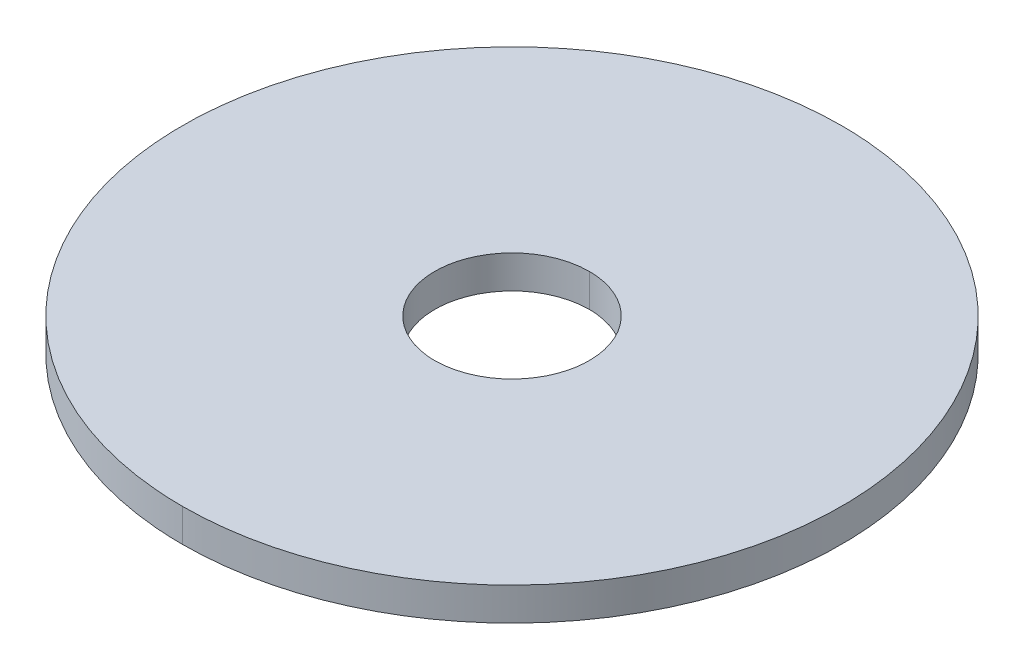
ISO-10303-21;
HEADER;
FILE_DESCRIPTION(('STEP AP214'),'2;1');
FILE_NAME('part.step','',(''),(''),'','','');
FILE_SCHEMA(('AUTOMOTIVE_DESIGN { 1 0 10303 214 1 1 1 1 }'));
ENDSEC;
DATA;
#1=APPLICATION_CONTEXT('core data for automotive mechanical design processes');
#2=APPLICATION_PROTOCOL_DEFINITION('international standard','automotive_design',2000,#1);
#3=PRODUCT_CONTEXT('',#1,'mechanical');
#4=PRODUCT('Part','Part','',(#3));
#5=PRODUCT_RELATED_PRODUCT_CATEGORY('part','',(#4));
#6=PRODUCT_DEFINITION_FORMATION('','',#4);
#7=PRODUCT_DEFINITION_CONTEXT('part definition',#1,'design');
#8=PRODUCT_DEFINITION('design','',#6,#7);
#9=PRODUCT_DEFINITION_SHAPE('','',#8);
#10=(LENGTH_UNIT() NAMED_UNIT(*) SI_UNIT(.MILLI.,.METRE.));
#11=(NAMED_UNIT(*) PLANE_ANGLE_UNIT() SI_UNIT($,.RADIAN.));
#12=(NAMED_UNIT(*) SI_UNIT($,.STERADIAN.) SOLID_ANGLE_UNIT());
#13=UNCERTAINTY_MEASURE_WITH_UNIT(LENGTH_MEASURE(1.E-05),#10,'distance_accuracy_value','');
#14=(GEOMETRIC_REPRESENTATION_CONTEXT(3) GLOBAL_UNCERTAINTY_ASSIGNED_CONTEXT((#13)) GLOBAL_UNIT_ASSIGNED_CONTEXT((#10,
#11,#12)) REPRESENTATION_CONTEXT('',''));
#15=CARTESIAN_POINT('',(0.,0.,0.));
#16=DIRECTION('',(0.,0.,1.));
#17=DIRECTION('',(1.,0.,0.));
#18=AXIS2_PLACEMENT_3D('',#15,#16,#17);
#19=CARTESIAN_POINT('',(0.,1.6,3.75));
#20=CARTESIAN_POINT('',(-3.75,1.6,3.75));
#21=CARTESIAN_POINT('',(-3.75,1.6,0.));
#22=CARTESIAN_POINT('',(-3.75,1.6,-3.75));
#23=CARTESIAN_POINT('',(0.,1.6,-3.75));
#24=CARTESIAN_POINT('',(0.,0.,3.75));
#25=CARTESIAN_POINT('',(-3.75,0.,3.75));
#26=CARTESIAN_POINT('',(-3.75,0.,0.));
#27=CARTESIAN_POINT('',(-3.75,0.,-3.75));
#28=CARTESIAN_POINT('',(0.,0.,-3.75));
#29=(BOUNDED_SURFACE() B_SPLINE_SURFACE(1,2,((#19,#20,#21,#22,#23),(#24,#25,#26,#27,#28)),
.UNSPECIFIED.,.F.,.F.,.F.) B_SPLINE_SURFACE_WITH_KNOTS((2,2),(3,2,3),(-0.213333333333333,
0.213333333333333),(-3.14159265358979,-1.5707963267949,0.),
.UNSPECIFIED.) GEOMETRIC_REPRESENTATION_ITEM() RATIONAL_B_SPLINE_SURFACE(((1.,0.707106781186548,
1.,0.707106781186548,1.),(1.,0.707106781186548,1.,0.707106781186548,1.))) REPRESENTATION_ITEM('') SURFACE());
#30=CARTESIAN_POINT('',(0.,1.6,-3.75));
#31=CARTESIAN_POINT('',(0.,0.,-3.75));
#32=(BOUNDED_CURVE() B_SPLINE_CURVE(1,(#30,#31),.UNSPECIFIED.,.F.,
.F.) B_SPLINE_CURVE_WITH_KNOTS((2,2),(-0.213333333333333,0.213333333333333),
.UNSPECIFIED.) CURVE() GEOMETRIC_REPRESENTATION_ITEM() RATIONAL_B_SPLINE_CURVE((1.,1.)) REPRESENTATION_ITEM(''));
#33=CARTESIAN_POINT('',(0.,1.6,-3.75));
#34=VERTEX_POINT('',#33);
#35=CARTESIAN_POINT('',(0.,0.,-3.75));
#36=VERTEX_POINT('',#35);
#37=EDGE_CURVE('E93',#34,#36,#32,.T.);
#38=CARTESIAN_POINT('',(0.,1.6,-3.75));
#39=CARTESIAN_POINT('',(-3.75,1.6,-3.75));
#40=CARTESIAN_POINT('',(-3.75,1.6,0.));
#41=CARTESIAN_POINT('',(-3.75,1.6,3.75));
#42=CARTESIAN_POINT('',(0.,1.6,3.75));
#43=(BOUNDED_CURVE() B_SPLINE_CURVE(2,(#38,#39,#40,#41,#42),.UNSPECIFIED.,.F.,
.F.) B_SPLINE_CURVE_WITH_KNOTS((3,2,3),(0.,1.5707963267949,3.14159265358979),
.UNSPECIFIED.) CURVE() GEOMETRIC_REPRESENTATION_ITEM() RATIONAL_B_SPLINE_CURVE((1.,
0.707106781186548,1.,0.707106781186548,1.)) REPRESENTATION_ITEM(''));
#44=CARTESIAN_POINT('',(0.,1.6,3.75));
#45=VERTEX_POINT('',#44);
#46=EDGE_CURVE('E11',#34,#45,#43,.T.);
#47=CARTESIAN_POINT('',(0.,1.6,3.75));
#48=CARTESIAN_POINT('',(0.,0.,3.75));
#49=(BOUNDED_CURVE() B_SPLINE_CURVE(1,(#47,#48),.UNSPECIFIED.,.F.,
.F.) B_SPLINE_CURVE_WITH_KNOTS((2,2),(-0.213333333333333,0.213333333333333),
.UNSPECIFIED.) CURVE() GEOMETRIC_REPRESENTATION_ITEM() RATIONAL_B_SPLINE_CURVE((1.,1.)) REPRESENTATION_ITEM(''));
#50=CARTESIAN_POINT('',(0.,0.,3.75));
#51=VERTEX_POINT('',#50);
#52=EDGE_CURVE('E99',#45,#51,#49,.T.);
#53=CARTESIAN_POINT('',(0.,0.,-3.75));
#54=CARTESIAN_POINT('',(-3.75,0.,-3.75));
#55=CARTESIAN_POINT('',(-3.75,0.,0.));
#56=CARTESIAN_POINT('',(-3.75,0.,3.75));
#57=CARTESIAN_POINT('',(0.,0.,3.75));
#58=(BOUNDED_CURVE() B_SPLINE_CURVE(2,(#53,#54,#55,#56,#57),.UNSPECIFIED.,.F.,
.F.) B_SPLINE_CURVE_WITH_KNOTS((3,2,3),(0.,1.5707963267949,3.14159265358979),
.UNSPECIFIED.) CURVE() GEOMETRIC_REPRESENTATION_ITEM() RATIONAL_B_SPLINE_CURVE((1.,
0.707106781186548,1.,0.707106781186548,1.)) REPRESENTATION_ITEM(''));
#59=EDGE_CURVE('E23',#36,#51,#58,.T.);
#60=ORIENTED_EDGE('',*,*,#37,.F.);
#61=ORIENTED_EDGE('',*,*,#46,.T.);
#62=ORIENTED_EDGE('',*,*,#52,.T.);
#63=ORIENTED_EDGE('',*,*,#59,.F.);
#64=EDGE_LOOP('',(#60,#61,#62,#63));
#65=FACE_BOUND('',#64,.T.);
#66=ADVANCED_FACE('F17',(#65),#29,.T.);
#67=CARTESIAN_POINT('',(0.,0.,16.));
#68=CARTESIAN_POINT('',(-16.,0.,16.));
#69=CARTESIAN_POINT('',(-16.,0.,0.));
#70=CARTESIAN_POINT('',(-16.,0.,-16.));
#71=CARTESIAN_POINT('',(0.,0.,-16.));
#72=CARTESIAN_POINT('',(0.,1.6,16.));
#73=CARTESIAN_POINT('',(-16.,1.6,16.));
#74=CARTESIAN_POINT('',(-16.,1.6,0.));
#75=CARTESIAN_POINT('',(-16.,1.6,-16.));
#76=CARTESIAN_POINT('',(0.,1.6,-16.));
#77=(BOUNDED_SURFACE() B_SPLINE_SURFACE(1,2,((#67,#68,#69,#70,#71),(#72,#73,#74,#75,#76)),
.UNSPECIFIED.,.F.,.F.,.F.) B_SPLINE_SURFACE_WITH_KNOTS((2,2),(3,2,3),(-0.05,0.05),
(-3.14159265358979,-1.5707963267949,0.),
.UNSPECIFIED.) GEOMETRIC_REPRESENTATION_ITEM() RATIONAL_B_SPLINE_SURFACE(((1.,0.707106781186548,
1.,0.707106781186548,1.),(1.,0.707106781186548,1.,0.707106781186548,1.))) REPRESENTATION_ITEM('') SURFACE());
#78=CARTESIAN_POINT('',(0.,0.,-16.));
#79=CARTESIAN_POINT('',(0.,1.6,-16.));
#80=(BOUNDED_CURVE() B_SPLINE_CURVE(1,(#78,#79),.UNSPECIFIED.,.F.,
.F.) B_SPLINE_CURVE_WITH_KNOTS((2,2),(-0.05,0.05),
.UNSPECIFIED.) CURVE() GEOMETRIC_REPRESENTATION_ITEM() RATIONAL_B_SPLINE_CURVE((1.,1.)) REPRESENTATION_ITEM(''));
#81=CARTESIAN_POINT('',(0.,0.,-16.));
#82=VERTEX_POINT('',#81);
#83=CARTESIAN_POINT('',(0.,1.6,-16.));
#84=VERTEX_POINT('',#83);
#85=EDGE_CURVE('E118',#82,#84,#80,.T.);
#86=CARTESIAN_POINT('',(0.,0.,-16.));
#87=CARTESIAN_POINT('',(-16.,0.,-16.));
#88=CARTESIAN_POINT('',(-16.,0.,0.));
#89=CARTESIAN_POINT('',(-16.,0.,16.));
#90=CARTESIAN_POINT('',(0.,0.,16.));
#91=(BOUNDED_CURVE() B_SPLINE_CURVE(2,(#86,#87,#88,#89,#90),.UNSPECIFIED.,.F.,
.F.) B_SPLINE_CURVE_WITH_KNOTS((3,2,3),(-3.14159265358981,-1.57079632679491,0.),
.UNSPECIFIED.) CURVE() GEOMETRIC_REPRESENTATION_ITEM() RATIONAL_B_SPLINE_CURVE((1.,
0.707106781186548,1.,0.707106781186547,1.)) REPRESENTATION_ITEM(''));
#92=CARTESIAN_POINT('',(0.,0.,16.));
#93=VERTEX_POINT('',#92);
#94=EDGE_CURVE('E57',#82,#93,#91,.T.);
#95=CARTESIAN_POINT('',(0.,0.,16.));
#96=CARTESIAN_POINT('',(0.,1.6,16.));
#97=(BOUNDED_CURVE() B_SPLINE_CURVE(1,(#95,#96),.UNSPECIFIED.,.F.,
.F.) B_SPLINE_CURVE_WITH_KNOTS((2,2),(-0.05,0.05),
.UNSPECIFIED.) CURVE() GEOMETRIC_REPRESENTATION_ITEM() RATIONAL_B_SPLINE_CURVE((1.,1.)) REPRESENTATION_ITEM(''));
#98=CARTESIAN_POINT('',(0.,1.6,16.));
#99=VERTEX_POINT('',#98);
#100=EDGE_CURVE('E133',#93,#99,#97,.T.);
#101=CARTESIAN_POINT('',(0.,1.6,-16.));
#102=CARTESIAN_POINT('',(-16.,1.6,-16.));
#103=CARTESIAN_POINT('',(-16.,1.6,0.));
#104=CARTESIAN_POINT('',(-16.,1.6,16.));
#105=CARTESIAN_POINT('',(0.,1.6,16.));
#106=(BOUNDED_CURVE() B_SPLINE_CURVE(2,(#101,#102,#103,#104,#105),.UNSPECIFIED.,.F.,
.F.) B_SPLINE_CURVE_WITH_KNOTS((3,2,3),(-3.14159265358981,-1.57079632679491,0.),
.UNSPECIFIED.) CURVE() GEOMETRIC_REPRESENTATION_ITEM() RATIONAL_B_SPLINE_CURVE((1.,
0.707106781186548,1.,0.707106781186547,1.)) REPRESENTATION_ITEM(''));
#107=EDGE_CURVE('E32',#84,#99,#106,.T.);
#108=ORIENTED_EDGE('',*,*,#85,.F.);
#109=ORIENTED_EDGE('',*,*,#94,.T.);
#110=ORIENTED_EDGE('',*,*,#100,.T.);
#111=ORIENTED_EDGE('',*,*,#107,.F.);
#112=EDGE_LOOP('',(#108,#109,#110,#111));
#113=FACE_BOUND('',#112,.T.);
#114=ADVANCED_FACE('F164',(#113),#77,.T.);
#115=CARTESIAN_POINT('',(-16.01,1.6,-16.01));
#116=CARTESIAN_POINT('',(16.01,1.6,-16.01));
#117=CARTESIAN_POINT('',(-16.01,1.6,16.01));
#118=CARTESIAN_POINT('',(16.01,1.6,16.01));
#119=(BOUNDED_SURFACE() B_SPLINE_SURFACE(1,1,((#115,#116),(#117,#118)),.UNSPECIFIED.,.F.,.F.,
.F.) B_SPLINE_SURFACE_WITH_KNOTS((2,2),(2,2),(-1.601,1.601),(-1.601,1.601),
.UNSPECIFIED.) GEOMETRIC_REPRESENTATION_ITEM() RATIONAL_B_SPLINE_SURFACE(((1.,1.),(1.,1.))) REPRESENTATION_ITEM('') SURFACE());
#120=CARTESIAN_POINT('',(0.,1.6,3.75));
#121=CARTESIAN_POINT('',(3.75,1.6,3.75));
#122=CARTESIAN_POINT('',(3.75,1.6,0.));
#123=CARTESIAN_POINT('',(3.75,1.6,-3.75));
#124=CARTESIAN_POINT('',(0.,1.6,-3.75));
#125=(BOUNDED_CURVE() B_SPLINE_CURVE(2,(#120,#121,#122,#123,#124),.UNSPECIFIED.,.F.,
.F.) B_SPLINE_CURVE_WITH_KNOTS((3,2,3),(3.14159265358979,4.71238898038469,6.28318530717959),
.UNSPECIFIED.) CURVE() GEOMETRIC_REPRESENTATION_ITEM() RATIONAL_B_SPLINE_CURVE((1.,
0.707106781186548,1.,0.707106781186547,1.)) REPRESENTATION_ITEM(''));
#126=EDGE_CURVE('E89',#45,#34,#125,.T.);
#127=CARTESIAN_POINT('',(0.,1.6,16.));
#128=CARTESIAN_POINT('',(16.,1.6,16.));
#129=CARTESIAN_POINT('',(16.,1.6,0.));
#130=CARTESIAN_POINT('',(16.,1.6,-16.));
#131=CARTESIAN_POINT('',(0.,1.6,-16.));
#132=(BOUNDED_CURVE() B_SPLINE_CURVE(2,(#127,#128,#129,#130,#131),.UNSPECIFIED.,.F.,
.F.) B_SPLINE_CURVE_WITH_KNOTS((3,2,3),(0.,1.57079632679488,3.14159265358978),
.UNSPECIFIED.) CURVE() GEOMETRIC_REPRESENTATION_ITEM() RATIONAL_B_SPLINE_CURVE((1.,
0.707106781186548,1.,0.707106781186547,1.)) REPRESENTATION_ITEM(''));
#133=EDGE_CURVE('E126',#99,#84,#132,.T.);
#134=ORIENTED_EDGE('',*,*,#46,.F.);
#135=ORIENTED_EDGE('',*,*,#126,.F.);
#136=EDGE_LOOP('',(#134,#135));
#137=FACE_BOUND('',#136,.T.);
#138=ORIENTED_EDGE('',*,*,#107,.T.);
#139=ORIENTED_EDGE('',*,*,#133,.T.);
#140=EDGE_LOOP('',(#138,#139));
#141=FACE_BOUND('',#140,.T.);
#142=ADVANCED_FACE('F87',(#137,#141),#119,.T.);
#143=CARTESIAN_POINT('',(-16.01,0.,16.01));
#144=CARTESIAN_POINT('',(16.01,0.,16.01));
#145=CARTESIAN_POINT('',(-16.01,0.,-16.01));
#146=CARTESIAN_POINT('',(16.01,0.,-16.01));
#147=(BOUNDED_SURFACE() B_SPLINE_SURFACE(1,1,((#143,#144),(#145,#146)),.UNSPECIFIED.,.F.,.F.,
.F.) B_SPLINE_SURFACE_WITH_KNOTS((2,2),(2,2),(-1.601,1.601),(-1.601,1.601),
.UNSPECIFIED.) GEOMETRIC_REPRESENTATION_ITEM() RATIONAL_B_SPLINE_SURFACE(((1.,1.),(1.,1.))) REPRESENTATION_ITEM('') SURFACE());
#148=CARTESIAN_POINT('',(0.,0.,3.75));
#149=CARTESIAN_POINT('',(3.75,0.,3.75));
#150=CARTESIAN_POINT('',(3.75,0.,0.));
#151=CARTESIAN_POINT('',(3.75,0.,-3.75));
#152=CARTESIAN_POINT('',(0.,0.,-3.75));
#153=(BOUNDED_CURVE() B_SPLINE_CURVE(2,(#148,#149,#150,#151,#152),.UNSPECIFIED.,.F.,
.F.) B_SPLINE_CURVE_WITH_KNOTS((3,2,3),(3.14159265358979,4.71238898038469,6.28318530717959),
.UNSPECIFIED.) CURVE() GEOMETRIC_REPRESENTATION_ITEM() RATIONAL_B_SPLINE_CURVE((1.,
0.707106781186548,1.,0.707106781186547,1.)) REPRESENTATION_ITEM(''));
#154=EDGE_CURVE('E97',#51,#36,#153,.T.);
#155=CARTESIAN_POINT('',(0.,0.,16.));
#156=CARTESIAN_POINT('',(16.,0.,16.));
#157=CARTESIAN_POINT('',(16.,0.,0.));
#158=CARTESIAN_POINT('',(16.,0.,-16.));
#159=CARTESIAN_POINT('',(0.,0.,-16.));
#160=(BOUNDED_CURVE() B_SPLINE_CURVE(2,(#155,#156,#157,#158,#159),.UNSPECIFIED.,.F.,
.F.) B_SPLINE_CURVE_WITH_KNOTS((3,2,3),(0.,1.57079632679488,3.14159265358978),
.UNSPECIFIED.) CURVE() GEOMETRIC_REPRESENTATION_ITEM() RATIONAL_B_SPLINE_CURVE((1.,
0.707106781186548,1.,0.707106781186547,1.)) REPRESENTATION_ITEM(''));
#161=EDGE_CURVE('E117',#93,#82,#160,.T.);
#162=ORIENTED_EDGE('',*,*,#59,.T.);
#163=ORIENTED_EDGE('',*,*,#154,.T.);
#164=EDGE_LOOP('',(#162,#163));
#165=FACE_BOUND('',#164,.T.);
#166=ORIENTED_EDGE('',*,*,#94,.F.);
#167=ORIENTED_EDGE('',*,*,#161,.F.);
#168=EDGE_LOOP('',(#166,#167));
#169=FACE_BOUND('',#168,.T.);
#170=ADVANCED_FACE('F156',(#165,#169),#147,.T.);
#171=CARTESIAN_POINT('',(0.,0.,-16.));
#172=CARTESIAN_POINT('',(16.,0.,-16.));
#173=CARTESIAN_POINT('',(16.,0.,0.));
#174=CARTESIAN_POINT('',(16.,0.,16.));
#175=CARTESIAN_POINT('',(0.,0.,16.));
#176=CARTESIAN_POINT('',(0.,1.6,-16.));
#177=CARTESIAN_POINT('',(16.,1.6,-16.));
#178=CARTESIAN_POINT('',(16.,1.6,0.));
#179=CARTESIAN_POINT('',(16.,1.6,16.));
#180=CARTESIAN_POINT('',(0.,1.6,16.));
#181=(BOUNDED_SURFACE() B_SPLINE_SURFACE(1,2,((#171,#172,#173,#174,#175),(#176,#177,#178,#179,
#180)),.UNSPECIFIED.,.F.,.F.,.F.) B_SPLINE_SURFACE_WITH_KNOTS((2,2),(3,2,3),(-0.05,0.05),(0.,
1.5707963267949,3.14159265358979),
.UNSPECIFIED.) GEOMETRIC_REPRESENTATION_ITEM() RATIONAL_B_SPLINE_SURFACE(((1.,0.707106781186548,
1.,0.707106781186548,1.),(1.,0.707106781186548,1.,0.707106781186548,1.))) REPRESENTATION_ITEM('') SURFACE());
#182=ORIENTED_EDGE('',*,*,#161,.T.);
#183=ORIENTED_EDGE('',*,*,#85,.T.);
#184=ORIENTED_EDGE('',*,*,#133,.F.);
#185=ORIENTED_EDGE('',*,*,#100,.F.);
#186=EDGE_LOOP('',(#182,#183,#184,#185));
#187=FACE_BOUND('',#186,.T.);
#188=ADVANCED_FACE('F154',(#187),#181,.T.);
#189=CARTESIAN_POINT('',(0.,1.6,-3.75));
#190=CARTESIAN_POINT('',(3.75,1.6,-3.75));
#191=CARTESIAN_POINT('',(3.75,1.6,0.));
#192=CARTESIAN_POINT('',(3.75,1.6,3.75));
#193=CARTESIAN_POINT('',(0.,1.6,3.75));
#194=CARTESIAN_POINT('',(0.,0.,-3.75));
#195=CARTESIAN_POINT('',(3.75,0.,-3.75));
#196=CARTESIAN_POINT('',(3.75,0.,0.));
#197=CARTESIAN_POINT('',(3.75,0.,3.75));
#198=CARTESIAN_POINT('',(0.,0.,3.75));
#199=(BOUNDED_SURFACE() B_SPLINE_SURFACE(1,2,((#189,#190,#191,#192,#193),(#194,#195,#196,#197,
#198)),.UNSPECIFIED.,.F.,.F.,.F.) B_SPLINE_SURFACE_WITH_KNOTS((2,2),(3,2,3),(-0.213333333333333,
0.213333333333333),(0.,1.5707963267949,3.14159265358979),
.UNSPECIFIED.) GEOMETRIC_REPRESENTATION_ITEM() RATIONAL_B_SPLINE_SURFACE(((1.,0.707106781186548,
1.,0.707106781186548,1.),(1.,0.707106781186548,1.,0.707106781186548,1.))) REPRESENTATION_ITEM('') SURFACE());
#200=ORIENTED_EDGE('',*,*,#126,.T.);
#201=ORIENTED_EDGE('',*,*,#37,.T.);
#202=ORIENTED_EDGE('',*,*,#154,.F.);
#203=ORIENTED_EDGE('',*,*,#52,.F.);
#204=EDGE_LOOP('',(#200,#201,#202,#203));
#205=FACE_BOUND('',#204,.T.);
#206=ADVANCED_FACE('F19',(#205),#199,.T.);
#207=CLOSED_SHELL('',(#66,#114,#142,#170,#188,#206));
#208=MANIFOLD_SOLID_BREP('B1',#207);
#209=ADVANCED_BREP_SHAPE_REPRESENTATION('',(#18,#208),#14);
#210=SHAPE_DEFINITION_REPRESENTATION(#9,#209);
ENDSEC;
END-ISO-10303-21;
